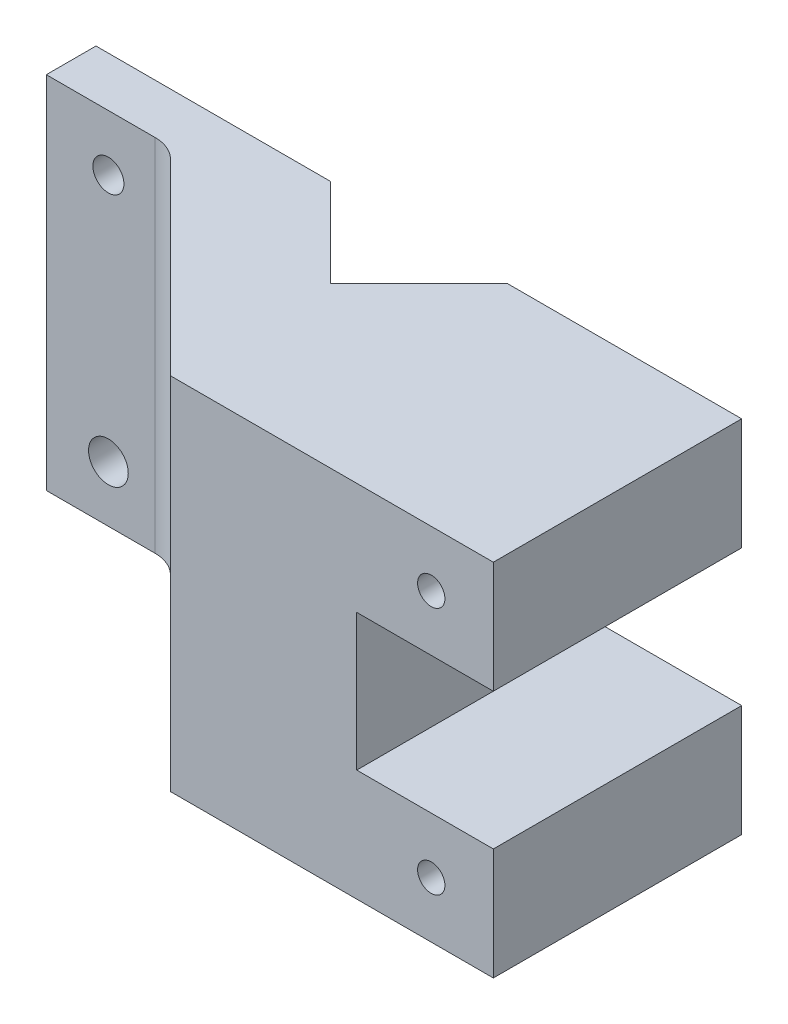
ISO-10303-21;
HEADER;
FILE_DESCRIPTION(('STEP AP214'),'2;1');
FILE_NAME('part.step','',(''),(''),'','','');
FILE_SCHEMA(('AUTOMOTIVE_DESIGN { 1 0 10303 214 1 1 1 1 }'));
ENDSEC;
DATA;
#1=APPLICATION_CONTEXT('core data for automotive mechanical design processes');
#2=APPLICATION_PROTOCOL_DEFINITION('international standard','automotive_design',2000,#1);
#3=PRODUCT_CONTEXT('',#1,'mechanical');
#4=PRODUCT('Part','Part','',(#3));
#5=PRODUCT_RELATED_PRODUCT_CATEGORY('part','',(#4));
#6=PRODUCT_DEFINITION_FORMATION('','',#4);
#7=PRODUCT_DEFINITION_CONTEXT('part definition',#1,'design');
#8=PRODUCT_DEFINITION('design','',#6,#7);
#9=PRODUCT_DEFINITION_SHAPE('','',#8);
#10=(LENGTH_UNIT() NAMED_UNIT(*) SI_UNIT(.MILLI.,.METRE.));
#11=(NAMED_UNIT(*) PLANE_ANGLE_UNIT() SI_UNIT($,.RADIAN.));
#12=(NAMED_UNIT(*) SI_UNIT($,.STERADIAN.) SOLID_ANGLE_UNIT());
#13=UNCERTAINTY_MEASURE_WITH_UNIT(LENGTH_MEASURE(1.E-05),#10,'distance_accuracy_value','');
#14=(GEOMETRIC_REPRESENTATION_CONTEXT(3) GLOBAL_UNCERTAINTY_ASSIGNED_CONTEXT((#13)) GLOBAL_UNIT_ASSIGNED_CONTEXT((#10,
#11,#12)) REPRESENTATION_CONTEXT('',''));
#15=CARTESIAN_POINT('',(0.,0.,0.));
#16=DIRECTION('',(0.,0.,1.));
#17=DIRECTION('',(1.,0.,0.));
#18=AXIS2_PLACEMENT_3D('',#15,#16,#17);
#19=CARTESIAN_POINT('',(26.,14.5,0.));
#20=DIRECTION('',(-1.,0.,0.));
#21=DIRECTION('',(0.,0.,1.));
#22=AXIS2_PLACEMENT_3D('',#19,#20,#21);
#23=PLANE('',#22);
#24=DIRECTION('',(0.,-1.,0.));
#25=VECTOR('',#24,1.);
#26=CARTESIAN_POINT('',(26.,14.5,0.));
#27=LINE('',#26,#25);
#28=CARTESIAN_POINT('',(26.,-5.5,0.));
#29=VERTEX_POINT('',#28);
#30=CARTESIAN_POINT('',(26.,-14.5,0.));
#31=VERTEX_POINT('',#30);
#32=EDGE_CURVE('E161',#29,#31,#27,.T.);
#33=ORIENTED_EDGE('',*,*,#32,.F.);
#34=DIRECTION('',(0.,0.,1.));
#35=VECTOR('',#34,1.);
#36=CARTESIAN_POINT('',(26.,-5.5,0.));
#37=LINE('',#36,#35);
#38=CARTESIAN_POINT('',(26.,-5.5,20.));
#39=VERTEX_POINT('',#38);
#40=EDGE_CURVE('E257',#29,#39,#37,.T.);
#41=ORIENTED_EDGE('',*,*,#40,.T.);
#42=DIRECTION('',(0.,-1.,0.));
#43=VECTOR('',#42,1.);
#44=CARTESIAN_POINT('',(26.,14.5,20.));
#45=LINE('',#44,#43);
#46=CARTESIAN_POINT('',(26.,-14.5,20.));
#47=VERTEX_POINT('',#46);
#48=EDGE_CURVE('E160',#39,#47,#45,.T.);
#49=ORIENTED_EDGE('',*,*,#48,.T.);
#50=DIRECTION('',(0.,0.,-1.));
#51=VECTOR('',#50,1.);
#52=CARTESIAN_POINT('',(26.,-14.5,0.));
#53=LINE('',#52,#51);
#54=EDGE_CURVE('E200',#47,#31,#53,.T.);
#55=ORIENTED_EDGE('',*,*,#54,.T.);
#56=EDGE_LOOP('',(#33,#41,#49,#55));
#57=FACE_BOUND('',#56,.T.);
#58=ADVANCED_FACE('F32',(#57),#23,.F.);
#59=CARTESIAN_POINT('',(-7.1317279836453,14.5,0.));
#60=DIRECTION('',(-0.707106781186547,0.,0.707106781186548));
#61=DIRECTION('',(0.707106781186548,0.,0.707106781186547));
#62=AXIS2_PLACEMENT_3D('',#59,#60,#61);
#63=PLANE('',#62);
#64=DIRECTION('',(-0.707106781186548,0.,-0.707106781186547));
#65=VECTOR('',#64,1.);
#66=CARTESIAN_POINT('',(-7.1317279836453,-14.5,0.));
#67=LINE('',#66,#65);
#68=CARTESIAN_POINT('',(0.,-14.5,7.1317279836453));
#69=VERTEX_POINT('',#68);
#70=CARTESIAN_POINT('',(-7.1317279836453,-14.5,0.));
#71=VERTEX_POINT('',#70);
#72=EDGE_CURVE('E228',#69,#71,#67,.T.);
#73=ORIENTED_EDGE('',*,*,#72,.T.);
#74=DIRECTION('',(0.,-1.,0.));
#75=VECTOR('',#74,1.);
#76=CARTESIAN_POINT('',(-7.1317279836453,14.5,0.));
#77=LINE('',#76,#75);
#78=CARTESIAN_POINT('',(-7.1317279836453,14.5,0.));
#79=VERTEX_POINT('',#78);
#80=EDGE_CURVE('E177',#79,#71,#77,.T.);
#81=ORIENTED_EDGE('',*,*,#80,.F.);
#82=DIRECTION('',(-0.707106781186548,0.,-0.707106781186547));
#83=VECTOR('',#82,1.);
#84=CARTESIAN_POINT('',(-7.1317279836453,14.5,0.));
#85=LINE('',#84,#83);
#86=CARTESIAN_POINT('',(0.,14.5,7.1317279836453));
#87=VERTEX_POINT('',#86);
#88=EDGE_CURVE('E211',#87,#79,#85,.T.);
#89=ORIENTED_EDGE('',*,*,#88,.F.);
#90=DIRECTION('',(0.,-1.,0.));
#91=VECTOR('',#90,1.);
#92=CARTESIAN_POINT('',(0.,14.5,7.1317279836453));
#93=LINE('',#92,#91);
#94=EDGE_CURVE('E212',#87,#69,#93,.T.);
#95=ORIENTED_EDGE('',*,*,#94,.T.);
#96=EDGE_LOOP('',(#73,#81,#89,#95));
#97=FACE_BOUND('',#96,.T.);
#98=ADVANCED_FACE('F277',(#97),#63,.F.);
#99=CARTESIAN_POINT('',(-7.1317279836453,14.5,0.));
#100=DIRECTION('',(0.,0.,1.));
#101=DIRECTION('',(1.,0.,0.));
#102=AXIS2_PLACEMENT_3D('',#99,#100,#101);
#103=PLANE('',#102);
#104=CARTESIAN_POINT('',(-21.,10.,0.));
#105=DIRECTION('',(0.,0.,1.));
#106=DIRECTION('',(1.,0.,0.));
#107=AXIS2_PLACEMENT_3D('',#104,#105,#106);
#108=CIRCLE('',#107,1.25);
#109=CARTESIAN_POINT('',(-19.75,10.,0.));
#110=VERTEX_POINT('',#109);
#111=EDGE_CURVE('E341',#110,#110,#108,.T.);
#112=ORIENTED_EDGE('',*,*,#111,.T.);
#113=EDGE_LOOP('',(#112));
#114=FACE_BOUND('',#113,.T.);
#115=CARTESIAN_POINT('',(-21.,-10.,0.));
#116=DIRECTION('',(0.,0.,1.));
#117=DIRECTION('',(1.,0.,0.));
#118=AXIS2_PLACEMENT_3D('',#115,#116,#117);
#119=CIRCLE('',#118,1.6);
#120=CARTESIAN_POINT('',(-19.4,-10.,0.));
#121=VERTEX_POINT('',#120);
#122=EDGE_CURVE('E345',#121,#121,#119,.T.);
#123=ORIENTED_EDGE('',*,*,#122,.T.);
#124=EDGE_LOOP('',(#123));
#125=FACE_BOUND('',#124,.T.);
#126=DIRECTION('',(-1.,0.,0.));
#127=VECTOR('',#126,1.);
#128=CARTESIAN_POINT('',(-7.1317279836453,-14.5,0.));
#129=LINE('',#128,#127);
#130=CARTESIAN_POINT('',(-26.,-14.5,0.));
#131=VERTEX_POINT('',#130);
#132=EDGE_CURVE('E230',#71,#131,#129,.T.);
#133=ORIENTED_EDGE('',*,*,#132,.T.);
#134=DIRECTION('',(0.,-1.,0.));
#135=VECTOR('',#134,1.);
#136=CARTESIAN_POINT('',(-26.,14.5,0.));
#137=LINE('',#136,#135);
#138=CARTESIAN_POINT('',(-26.,14.5,0.));
#139=VERTEX_POINT('',#138);
#140=EDGE_CURVE('E174',#139,#131,#137,.T.);
#141=ORIENTED_EDGE('',*,*,#140,.F.);
#142=DIRECTION('',(-1.,0.,0.));
#143=VECTOR('',#142,1.);
#144=CARTESIAN_POINT('',(-7.1317279836453,14.5,0.));
#145=LINE('',#144,#143);
#146=EDGE_CURVE('E244',#79,#139,#145,.T.);
#147=ORIENTED_EDGE('',*,*,#146,.F.);
#148=ORIENTED_EDGE('',*,*,#80,.T.);
#149=EDGE_LOOP('',(#133,#141,#147,#148));
#150=FACE_BOUND('',#149,.T.);
#151=ADVANCED_FACE('F274',(#114,#125,#150),#103,.F.);
#152=CARTESIAN_POINT('',(-26.,14.5,0.));
#153=DIRECTION('',(1.,0.,0.));
#154=DIRECTION('',(0.,0.,-1.));
#155=AXIS2_PLACEMENT_3D('',#152,#153,#154);
#156=PLANE('',#155);
#157=DIRECTION('',(0.,0.,1.));
#158=VECTOR('',#157,1.);
#159=CARTESIAN_POINT('',(-26.,-14.5,0.));
#160=LINE('',#159,#158);
#161=CARTESIAN_POINT('',(-26.,-14.5,4.));
#162=VERTEX_POINT('',#161);
#163=EDGE_CURVE('E202',#131,#162,#160,.T.);
#164=ORIENTED_EDGE('',*,*,#163,.T.);
#165=DIRECTION('',(0.,-1.,0.));
#166=VECTOR('',#165,1.);
#167=CARTESIAN_POINT('',(-26.,14.5,4.));
#168=LINE('',#167,#166);
#169=CARTESIAN_POINT('',(-26.,14.5,4.));
#170=VERTEX_POINT('',#169);
#171=EDGE_CURVE('E171',#170,#162,#168,.T.);
#172=ORIENTED_EDGE('',*,*,#171,.F.);
#173=DIRECTION('',(0.,0.,1.));
#174=VECTOR('',#173,1.);
#175=CARTESIAN_POINT('',(-26.,14.5,0.));
#176=LINE('',#175,#174);
#177=EDGE_CURVE('E240',#139,#170,#176,.T.);
#178=ORIENTED_EDGE('',*,*,#177,.F.);
#179=ORIENTED_EDGE('',*,*,#140,.T.);
#180=EDGE_LOOP('',(#164,#172,#178,#179));
#181=FACE_BOUND('',#180,.T.);
#182=ADVANCED_FACE('F235',(#181),#156,.F.);
#183=CARTESIAN_POINT('',(-26.,14.5,4.));
#184=DIRECTION('',(0.,0.,-1.));
#185=DIRECTION('',(-1.,0.,0.));
#186=AXIS2_PLACEMENT_3D('',#183,#184,#185);
#187=PLANE('',#186);
#188=CARTESIAN_POINT('',(-21.,10.,4.00000000000001));
#189=DIRECTION('',(0.,0.,1.));
#190=DIRECTION('',(1.,0.,0.));
#191=AXIS2_PLACEMENT_3D('',#188,#189,#190);
#192=CIRCLE('',#191,1.25);
#193=CARTESIAN_POINT('',(-19.75,10.,4.00000000000001));
#194=VERTEX_POINT('',#193);
#195=EDGE_CURVE('E344',#194,#194,#192,.T.);
#196=ORIENTED_EDGE('',*,*,#195,.F.);
#197=EDGE_LOOP('',(#196));
#198=FACE_BOUND('',#197,.T.);
#199=CARTESIAN_POINT('',(-21.,-10.,4.00000000000001));
#200=DIRECTION('',(0.,0.,1.));
#201=DIRECTION('',(1.,0.,0.));
#202=AXIS2_PLACEMENT_3D('',#199,#200,#201);
#203=CIRCLE('',#202,1.6);
#204=CARTESIAN_POINT('',(-19.4,-10.,4.00000000000001));
#205=VERTEX_POINT('',#204);
#206=EDGE_CURVE('E350',#205,#205,#203,.T.);
#207=ORIENTED_EDGE('',*,*,#206,.F.);
#208=EDGE_LOOP('',(#207));
#209=FACE_BOUND('',#208,.T.);
#210=DIRECTION('',(1.,0.,0.));
#211=VECTOR('',#210,1.);
#212=CARTESIAN_POINT('',(-26.,-14.5,4.));
#213=LINE('',#212,#211);
#214=CARTESIAN_POINT('',(-17.2426406871193,-14.5,4.));
#215=VERTEX_POINT('',#214);
#216=EDGE_CURVE('E198',#162,#215,#213,.T.);
#217=ORIENTED_EDGE('',*,*,#216,.T.);
#218=DIRECTION('',(0.,-1.,0.));
#219=VECTOR('',#218,1.);
#220=CARTESIAN_POINT('',(-17.2426406871193,14.5,4.));
#221=LINE('',#220,#219);
#222=CARTESIAN_POINT('',(-17.2426406871193,14.5,4.));
#223=VERTEX_POINT('',#222);
#224=EDGE_CURVE('E47',#215,#223,#221,.F.);
#225=ORIENTED_EDGE('',*,*,#224,.T.);
#226=DIRECTION('',(1.,0.,0.));
#227=VECTOR('',#226,1.);
#228=CARTESIAN_POINT('',(-26.,14.5,4.));
#229=LINE('',#228,#227);
#230=EDGE_CURVE('E239',#170,#223,#229,.T.);
#231=ORIENTED_EDGE('',*,*,#230,.F.);
#232=ORIENTED_EDGE('',*,*,#171,.T.);
#233=EDGE_LOOP('',(#217,#225,#231,#232));
#234=FACE_BOUND('',#233,.T.);
#235=ADVANCED_FACE('F238',(#198,#209,#234),#187,.F.);
#236=CARTESIAN_POINT('',(-16.,14.5,4.));
#237=DIRECTION('',(0.707106781186548,0.,-0.707106781186548));
#238=DIRECTION('',(-0.707106781186548,0.,-0.707106781186548));
#239=AXIS2_PLACEMENT_3D('',#236,#237,#238);
#240=PLANE('',#239);
#241=DIRECTION('',(0.707106781186548,0.,0.707106781186548));
#242=VECTOR('',#241,1.);
#243=CARTESIAN_POINT('',(-16.,14.5,4.));
#244=LINE('',#243,#242);
#245=CARTESIAN_POINT('',(-15.1213203435596,14.5,4.87867965644036));
#246=VERTEX_POINT('',#245);
#247=CARTESIAN_POINT('',(0.,14.5,20.));
#248=VERTEX_POINT('',#247);
#249=EDGE_CURVE('E189',#246,#248,#244,.T.);
#250=ORIENTED_EDGE('',*,*,#249,.F.);
#251=DIRECTION('',(0.,-1.,0.));
#252=VECTOR('',#251,1.);
#253=CARTESIAN_POINT('',(-15.1213203435596,-14.5,4.87867965644036));
#254=LINE('',#253,#252);
#255=CARTESIAN_POINT('',(-15.1213203435596,-14.5,4.87867965644036));
#256=VERTEX_POINT('',#255);
#257=EDGE_CURVE('E180',#246,#256,#254,.T.);
#258=ORIENTED_EDGE('',*,*,#257,.T.);
#259=DIRECTION('',(0.707106781186548,0.,0.707106781186548));
#260=VECTOR('',#259,1.);
#261=CARTESIAN_POINT('',(-16.,-14.5,4.));
#262=LINE('',#261,#260);
#263=CARTESIAN_POINT('',(0.,-14.5,20.));
#264=VERTEX_POINT('',#263);
#265=EDGE_CURVE('E188',#256,#264,#262,.T.);
#266=ORIENTED_EDGE('',*,*,#265,.T.);
#267=DIRECTION('',(0.,-1.,0.));
#268=VECTOR('',#267,1.);
#269=CARTESIAN_POINT('',(0.,14.5,20.));
#270=LINE('',#269,#268);
#271=EDGE_CURVE('E168',#248,#264,#270,.T.);
#272=ORIENTED_EDGE('',*,*,#271,.F.);
#273=EDGE_LOOP('',(#250,#258,#266,#272));
#274=FACE_BOUND('',#273,.T.);
#275=ADVANCED_FACE('F186',(#274),#240,.F.);
#276=CARTESIAN_POINT('',(26.,14.5,20.));
#277=DIRECTION('',(0.,0.,-1.));
#278=DIRECTION('',(-1.,0.,0.));
#279=AXIS2_PLACEMENT_3D('',#276,#277,#278);
#280=PLANE('',#279);
#281=CARTESIAN_POINT('',(21.,-10.,20.));
#282=DIRECTION('',(0.,0.,-1.));
#283=DIRECTION('',(-1.,0.,0.));
#284=AXIS2_PLACEMENT_3D('',#281,#282,#283);
#285=CIRCLE('',#284,1.1);
#286=CARTESIAN_POINT('',(19.9,-10.,20.));
#287=VERTEX_POINT('',#286);
#288=EDGE_CURVE('E231',#287,#287,#285,.T.);
#289=ORIENTED_EDGE('',*,*,#288,.T.);
#290=EDGE_LOOP('',(#289));
#291=FACE_BOUND('',#290,.T.);
#292=CARTESIAN_POINT('',(21.,10.,20.));
#293=DIRECTION('',(0.,0.,-1.));
#294=DIRECTION('',(-1.,0.,0.));
#295=AXIS2_PLACEMENT_3D('',#292,#293,#294);
#296=CIRCLE('',#295,1.1);
#297=CARTESIAN_POINT('',(19.9,10.,20.));
#298=VERTEX_POINT('',#297);
#299=EDGE_CURVE('E267',#298,#298,#296,.T.);
#300=ORIENTED_EDGE('',*,*,#299,.T.);
#301=EDGE_LOOP('',(#300));
#302=FACE_BOUND('',#301,.T.);
#303=ORIENTED_EDGE('',*,*,#48,.F.);
#304=DIRECTION('',(-1.,0.,0.));
#305=VECTOR('',#304,1.);
#306=CARTESIAN_POINT('',(26.,-5.5,20.));
#307=LINE('',#306,#305);
#308=CARTESIAN_POINT('',(15.,-5.5,20.));
#309=VERTEX_POINT('',#308);
#310=EDGE_CURVE('E259',#39,#309,#307,.T.);
#311=ORIENTED_EDGE('',*,*,#310,.T.);
#312=DIRECTION('',(0.,1.,0.));
#313=VECTOR('',#312,1.);
#314=CARTESIAN_POINT('',(15.,14.5,20.));
#315=LINE('',#314,#313);
#316=CARTESIAN_POINT('',(15.,5.5,20.));
#317=VERTEX_POINT('',#316);
#318=EDGE_CURVE('E256',#309,#317,#315,.T.);
#319=ORIENTED_EDGE('',*,*,#318,.T.);
#320=DIRECTION('',(1.,0.,0.));
#321=VECTOR('',#320,1.);
#322=CARTESIAN_POINT('',(26.,5.5,20.));
#323=LINE('',#322,#321);
#324=CARTESIAN_POINT('',(26.,5.5,20.));
#325=VERTEX_POINT('',#324);
#326=EDGE_CURVE('E254',#317,#325,#323,.T.);
#327=ORIENTED_EDGE('',*,*,#326,.T.);
#328=CARTESIAN_POINT('',(26.,14.5,20.));
#329=VERTEX_POINT('',#328);
#330=EDGE_CURVE('E154',#329,#325,#45,.T.);
#331=ORIENTED_EDGE('',*,*,#330,.F.);
#332=DIRECTION('',(1.,0.,0.));
#333=VECTOR('',#332,1.);
#334=CARTESIAN_POINT('',(26.,14.5,20.));
#335=LINE('',#334,#333);
#336=EDGE_CURVE('E242',#248,#329,#335,.T.);
#337=ORIENTED_EDGE('',*,*,#336,.F.);
#338=ORIENTED_EDGE('',*,*,#271,.T.);
#339=DIRECTION('',(1.,0.,0.));
#340=VECTOR('',#339,1.);
#341=CARTESIAN_POINT('',(26.,-14.5,20.));
#342=LINE('',#341,#340);
#343=EDGE_CURVE('E197',#264,#47,#342,.T.);
#344=ORIENTED_EDGE('',*,*,#343,.T.);
#345=EDGE_LOOP('',(#303,#311,#319,#327,#331,#337,#338,#344));
#346=FACE_BOUND('',#345,.T.);
#347=ADVANCED_FACE('F252',(#291,#302,#346),#280,.F.);
#348=ORIENTED_EDGE('',*,*,#330,.T.);
#349=DIRECTION('',(0.,0.,1.));
#350=VECTOR('',#349,1.);
#351=CARTESIAN_POINT('',(26.,5.5,0.));
#352=LINE('',#351,#350);
#353=CARTESIAN_POINT('',(26.,5.5,0.));
#354=VERTEX_POINT('',#353);
#355=EDGE_CURVE('E136',#354,#325,#352,.T.);
#356=ORIENTED_EDGE('',*,*,#355,.F.);
#357=CARTESIAN_POINT('',(26.,14.5,0.));
#358=VERTEX_POINT('',#357);
#359=EDGE_CURVE('E151',#358,#354,#27,.T.);
#360=ORIENTED_EDGE('',*,*,#359,.F.);
#361=DIRECTION('',(0.,0.,-1.));
#362=VECTOR('',#361,1.);
#363=CARTESIAN_POINT('',(26.,14.5,0.));
#364=LINE('',#363,#362);
#365=EDGE_CURVE('E224',#329,#358,#364,.T.);
#366=ORIENTED_EDGE('',*,*,#365,.F.);
#367=EDGE_LOOP('',(#348,#356,#360,#366));
#368=FACE_BOUND('',#367,.T.);
#369=ADVANCED_FACE('F149',(#368),#23,.F.);
#370=CARTESIAN_POINT('',(7.1317279836453,14.5,0.));
#371=DIRECTION('',(0.,0.,1.));
#372=DIRECTION('',(1.,0.,0.));
#373=AXIS2_PLACEMENT_3D('',#370,#371,#372);
#374=PLANE('',#373);
#375=CARTESIAN_POINT('',(21.,-10.,0.));
#376=DIRECTION('',(0.,0.,1.));
#377=DIRECTION('',(1.,0.,0.));
#378=AXIS2_PLACEMENT_3D('',#375,#376,#377);
#379=CIRCLE('',#378,1.1);
#380=CARTESIAN_POINT('',(22.1,-10.,0.));
#381=VERTEX_POINT('',#380);
#382=EDGE_CURVE('E347',#381,#381,#379,.T.);
#383=ORIENTED_EDGE('',*,*,#382,.T.);
#384=EDGE_LOOP('',(#383));
#385=FACE_BOUND('',#384,.T.);
#386=CARTESIAN_POINT('',(21.,10.,0.));
#387=DIRECTION('',(0.,0.,1.));
#388=DIRECTION('',(1.,0.,0.));
#389=AXIS2_PLACEMENT_3D('',#386,#387,#388);
#390=CIRCLE('',#389,1.1);
#391=CARTESIAN_POINT('',(22.1,10.,0.));
#392=VERTEX_POINT('',#391);
#393=EDGE_CURVE('E144',#392,#392,#390,.T.);
#394=ORIENTED_EDGE('',*,*,#393,.T.);
#395=EDGE_LOOP('',(#394));
#396=FACE_BOUND('',#395,.T.);
#397=DIRECTION('',(0.,-1.,0.));
#398=VECTOR('',#397,1.);
#399=CARTESIAN_POINT('',(15.,5.5,0.));
#400=LINE('',#399,#398);
#401=CARTESIAN_POINT('',(15.,5.5,0.));
#402=VERTEX_POINT('',#401);
#403=CARTESIAN_POINT('',(15.,-5.5,0.));
#404=VERTEX_POINT('',#403);
#405=EDGE_CURVE('E143',#402,#404,#400,.T.);
#406=ORIENTED_EDGE('',*,*,#405,.T.);
#407=DIRECTION('',(1.,0.,0.));
#408=VECTOR('',#407,1.);
#409=CARTESIAN_POINT('',(15.,-5.5,0.));
#410=LINE('',#409,#408);
#411=EDGE_CURVE('E155',#404,#29,#410,.T.);
#412=ORIENTED_EDGE('',*,*,#411,.T.);
#413=ORIENTED_EDGE('',*,*,#32,.T.);
#414=DIRECTION('',(-1.,0.,0.));
#415=VECTOR('',#414,1.);
#416=CARTESIAN_POINT('',(7.1317279836453,-14.5,0.));
#417=LINE('',#416,#415);
#418=CARTESIAN_POINT('',(7.1317279836453,-14.5,0.));
#419=VERTEX_POINT('',#418);
#420=EDGE_CURVE('E208',#31,#419,#417,.T.);
#421=ORIENTED_EDGE('',*,*,#420,.T.);
#422=DIRECTION('',(0.,-1.,0.));
#423=VECTOR('',#422,1.);
#424=CARTESIAN_POINT('',(7.1317279836453,14.5,0.));
#425=LINE('',#424,#423);
#426=CARTESIAN_POINT('',(7.1317279836453,14.5,0.));
#427=VERTEX_POINT('',#426);
#428=EDGE_CURVE('E164',#427,#419,#425,.T.);
#429=ORIENTED_EDGE('',*,*,#428,.F.);
#430=DIRECTION('',(-1.,0.,0.));
#431=VECTOR('',#430,1.);
#432=CARTESIAN_POINT('',(7.1317279836453,14.5,0.));
#433=LINE('',#432,#431);
#434=EDGE_CURVE('E159',#358,#427,#433,.T.);
#435=ORIENTED_EDGE('',*,*,#434,.F.);
#436=ORIENTED_EDGE('',*,*,#359,.T.);
#437=DIRECTION('',(-1.,0.,0.));
#438=VECTOR('',#437,1.);
#439=CARTESIAN_POINT('',(26.,5.5,0.));
#440=LINE('',#439,#438);
#441=EDGE_CURVE('E133',#354,#402,#440,.T.);
#442=ORIENTED_EDGE('',*,*,#441,.T.);
#443=EDGE_LOOP('',(#406,#412,#413,#421,#429,#435,#436,#442));
#444=FACE_BOUND('',#443,.T.);
#445=ADVANCED_FACE('F157',(#385,#396,#444),#374,.F.);
#446=CARTESIAN_POINT('',(0.,14.5,7.1317279836453));
#447=DIRECTION('',(0.707106781186547,0.,0.707106781186548));
#448=DIRECTION('',(0.707106781186548,0.,-0.707106781186547));
#449=AXIS2_PLACEMENT_3D('',#446,#447,#448);
#450=PLANE('',#449);
#451=DIRECTION('',(-0.707106781186548,0.,0.707106781186547));
#452=VECTOR('',#451,1.);
#453=CARTESIAN_POINT('',(0.,-14.5,7.1317279836453));
#454=LINE('',#453,#452);
#455=EDGE_CURVE('E210',#419,#69,#454,.T.);
#456=ORIENTED_EDGE('',*,*,#455,.T.);
#457=ORIENTED_EDGE('',*,*,#94,.F.);
#458=DIRECTION('',(-0.707106781186548,0.,0.707106781186547));
#459=VECTOR('',#458,1.);
#460=CARTESIAN_POINT('',(0.,14.5,7.1317279836453));
#461=LINE('',#460,#459);
#462=EDGE_CURVE('E214',#427,#87,#461,.T.);
#463=ORIENTED_EDGE('',*,*,#462,.F.);
#464=ORIENTED_EDGE('',*,*,#428,.T.);
#465=EDGE_LOOP('',(#456,#457,#463,#464));
#466=FACE_BOUND('',#465,.T.);
#467=ADVANCED_FACE('F301',(#466),#450,.F.);
#468=CARTESIAN_POINT('',(0.,14.5,0.));
#469=DIRECTION('',(0.,1.,0.));
#470=DIRECTION('',(0.,0.,1.));
#471=AXIS2_PLACEMENT_3D('',#468,#469,#470);
#472=PLANE('',#471);
#473=ORIENTED_EDGE('',*,*,#88,.T.);
#474=ORIENTED_EDGE('',*,*,#146,.T.);
#475=ORIENTED_EDGE('',*,*,#177,.T.);
#476=ORIENTED_EDGE('',*,*,#230,.T.);
#477=CARTESIAN_POINT('',(-17.2426406871193,14.5,7.));
#478=DIRECTION('',(0.,1.,0.));
#479=DIRECTION('',(0.,0.,1.));
#480=AXIS2_PLACEMENT_3D('',#477,#478,#479);
#481=CIRCLE('',#480,3.);
#482=EDGE_CURVE('E11',#223,#246,#481,.F.);
#483=ORIENTED_EDGE('',*,*,#482,.T.);
#484=ORIENTED_EDGE('',*,*,#249,.T.);
#485=ORIENTED_EDGE('',*,*,#336,.T.);
#486=ORIENTED_EDGE('',*,*,#365,.T.);
#487=ORIENTED_EDGE('',*,*,#434,.T.);
#488=ORIENTED_EDGE('',*,*,#462,.T.);
#489=EDGE_LOOP('',(#473,#474,#475,#476,#483,#484,#485,#486,#487,#488));
#490=FACE_BOUND('',#489,.T.);
#491=ADVANCED_FACE('F248',(#490),#472,.T.);
#492=CARTESIAN_POINT('',(0.,-14.5,0.));
#493=DIRECTION('',(0.,1.,0.));
#494=DIRECTION('',(0.,0.,1.));
#495=AXIS2_PLACEMENT_3D('',#492,#493,#494);
#496=PLANE('',#495);
#497=ORIENTED_EDGE('',*,*,#72,.F.);
#498=ORIENTED_EDGE('',*,*,#455,.F.);
#499=ORIENTED_EDGE('',*,*,#420,.F.);
#500=ORIENTED_EDGE('',*,*,#54,.F.);
#501=ORIENTED_EDGE('',*,*,#343,.F.);
#502=ORIENTED_EDGE('',*,*,#265,.F.);
#503=CARTESIAN_POINT('',(-17.2426406871193,-14.5,7.));
#504=DIRECTION('',(0.,1.,0.));
#505=DIRECTION('',(0.,0.,1.));
#506=AXIS2_PLACEMENT_3D('',#503,#504,#505);
#507=CIRCLE('',#506,3.);
#508=EDGE_CURVE('E40',#256,#215,#507,.T.);
#509=ORIENTED_EDGE('',*,*,#508,.T.);
#510=ORIENTED_EDGE('',*,*,#216,.F.);
#511=ORIENTED_EDGE('',*,*,#163,.F.);
#512=ORIENTED_EDGE('',*,*,#132,.F.);
#513=EDGE_LOOP('',(#497,#498,#499,#500,#501,#502,#509,#510,#511,#512));
#514=FACE_BOUND('',#513,.T.);
#515=ADVANCED_FACE('F194',(#514),#496,.F.);
#516=CARTESIAN_POINT('',(15.,-5.5,0.));
#517=DIRECTION('',(0.,-1.,0.));
#518=DIRECTION('',(1.,0.,0.));
#519=AXIS2_PLACEMENT_3D('',#516,#517,#518);
#520=PLANE('',#519);
#521=ORIENTED_EDGE('',*,*,#40,.F.);
#522=ORIENTED_EDGE('',*,*,#411,.F.);
#523=DIRECTION('',(0.,0.,1.));
#524=VECTOR('',#523,1.);
#525=CARTESIAN_POINT('',(15.,-5.5,0.));
#526=LINE('',#525,#524);
#527=EDGE_CURVE('E262',#404,#309,#526,.T.);
#528=ORIENTED_EDGE('',*,*,#527,.T.);
#529=ORIENTED_EDGE('',*,*,#310,.F.);
#530=EDGE_LOOP('',(#521,#522,#528,#529));
#531=FACE_BOUND('',#530,.T.);
#532=ADVANCED_FACE('F308',(#531),#520,.F.);
#533=CARTESIAN_POINT('',(15.,5.5,0.));
#534=DIRECTION('',(-1.,0.,0.));
#535=DIRECTION('',(0.,-1.,0.));
#536=AXIS2_PLACEMENT_3D('',#533,#534,#535);
#537=PLANE('',#536);
#538=ORIENTED_EDGE('',*,*,#527,.F.);
#539=ORIENTED_EDGE('',*,*,#405,.F.);
#540=DIRECTION('',(0.,0.,1.));
#541=VECTOR('',#540,1.);
#542=CARTESIAN_POINT('',(15.,5.5,0.));
#543=LINE('',#542,#541);
#544=EDGE_CURVE('E139',#402,#317,#543,.T.);
#545=ORIENTED_EDGE('',*,*,#544,.T.);
#546=ORIENTED_EDGE('',*,*,#318,.F.);
#547=EDGE_LOOP('',(#538,#539,#545,#546));
#548=FACE_BOUND('',#547,.T.);
#549=ADVANCED_FACE('F314',(#548),#537,.F.);
#550=CARTESIAN_POINT('',(26.,5.5,0.));
#551=DIRECTION('',(0.,1.,0.));
#552=DIRECTION('',(-1.,0.,0.));
#553=AXIS2_PLACEMENT_3D('',#550,#551,#552);
#554=PLANE('',#553);
#555=ORIENTED_EDGE('',*,*,#544,.F.);
#556=ORIENTED_EDGE('',*,*,#441,.F.);
#557=ORIENTED_EDGE('',*,*,#355,.T.);
#558=ORIENTED_EDGE('',*,*,#326,.F.);
#559=EDGE_LOOP('',(#555,#556,#557,#558));
#560=FACE_BOUND('',#559,.T.);
#561=ADVANCED_FACE('F135',(#560),#554,.F.);
#562=CARTESIAN_POINT('',(21.,10.,0.));
#563=DIRECTION('',(0.,0.,1.));
#564=DIRECTION('',(1.,0.,0.));
#565=AXIS2_PLACEMENT_3D('',#562,#563,#564);
#566=CYLINDRICAL_SURFACE('',#565,1.1);
#567=ORIENTED_EDGE('',*,*,#393,.F.);
#568=EDGE_LOOP('',(#567));
#569=FACE_BOUND('',#568,.T.);
#570=ORIENTED_EDGE('',*,*,#299,.F.);
#571=EDGE_LOOP('',(#570));
#572=FACE_BOUND('',#571,.T.);
#573=ADVANCED_FACE('F313',(#569,#572),#566,.F.);
#574=CARTESIAN_POINT('',(21.,-10.,0.));
#575=DIRECTION('',(0.,0.,1.));
#576=DIRECTION('',(1.,0.,0.));
#577=AXIS2_PLACEMENT_3D('',#574,#575,#576);
#578=CYLINDRICAL_SURFACE('',#577,1.1);
#579=ORIENTED_EDGE('',*,*,#382,.F.);
#580=EDGE_LOOP('',(#579));
#581=FACE_BOUND('',#580,.T.);
#582=ORIENTED_EDGE('',*,*,#288,.F.);
#583=EDGE_LOOP('',(#582));
#584=FACE_BOUND('',#583,.T.);
#585=ADVANCED_FACE('F321',(#581,#584),#578,.F.);
#586=CARTESIAN_POINT('',(-21.,-10.,0.));
#587=DIRECTION('',(0.,0.,1.));
#588=DIRECTION('',(1.,0.,0.));
#589=AXIS2_PLACEMENT_3D('',#586,#587,#588);
#590=CYLINDRICAL_SURFACE('',#589,1.6);
#591=ORIENTED_EDGE('',*,*,#122,.F.);
#592=EDGE_LOOP('',(#591));
#593=FACE_BOUND('',#592,.T.);
#594=ORIENTED_EDGE('',*,*,#206,.T.);
#595=EDGE_LOOP('',(#594));
#596=FACE_BOUND('',#595,.T.);
#597=ADVANCED_FACE('F324',(#593,#596),#590,.F.);
#598=CARTESIAN_POINT('',(-21.,10.,0.));
#599=DIRECTION('',(0.,0.,1.));
#600=DIRECTION('',(1.,0.,0.));
#601=AXIS2_PLACEMENT_3D('',#598,#599,#600);
#602=CYLINDRICAL_SURFACE('',#601,1.25);
#603=ORIENTED_EDGE('',*,*,#111,.F.);
#604=EDGE_LOOP('',(#603));
#605=FACE_BOUND('',#604,.T.);
#606=ORIENTED_EDGE('',*,*,#195,.T.);
#607=EDGE_LOOP('',(#606));
#608=FACE_BOUND('',#607,.T.);
#609=ADVANCED_FACE('F331',(#605,#608),#602,.F.);
#610=CARTESIAN_POINT('',(-17.2426406871193,14.5,7.));
#611=DIRECTION('',(0.,1.,0.));
#612=DIRECTION('',(0.,0.,1.));
#613=AXIS2_PLACEMENT_3D('',#610,#611,#612);
#614=CYLINDRICAL_SURFACE('',#613,3.);
#615=ORIENTED_EDGE('',*,*,#482,.F.);
#616=ORIENTED_EDGE('',*,*,#224,.F.);
#617=ORIENTED_EDGE('',*,*,#508,.F.);
#618=ORIENTED_EDGE('',*,*,#257,.F.);
#619=EDGE_LOOP('',(#615,#616,#617,#618));
#620=FACE_BOUND('',#619,.T.);
#621=ADVANCED_FACE('F34',(#620),#614,.F.);
#622=CLOSED_SHELL('',(#58,#98,#151,#182,#235,#275,#347,#369,#445,#467,#491,#515,#532,#549,#561,
#573,#585,#597,#609,#621));
#623=MANIFOLD_SOLID_BREP('B2',#622);
#624=ADVANCED_BREP_SHAPE_REPRESENTATION('',(#18,#623),#14);
#625=SHAPE_DEFINITION_REPRESENTATION(#9,#624);
ENDSEC;
END-ISO-10303-21;
